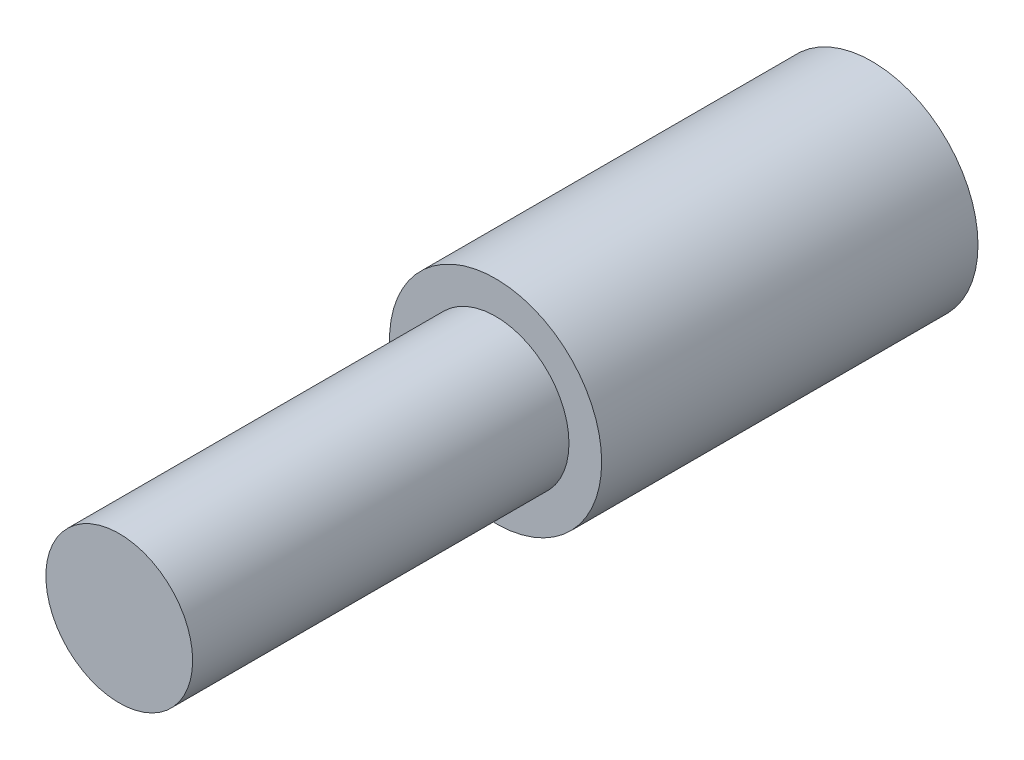
ISO-10303-21;
HEADER;
FILE_DESCRIPTION(('STEP AP214'),'2;1');
FILE_NAME('part.step','',(''),(''),'','','');
FILE_SCHEMA(('AUTOMOTIVE_DESIGN { 1 0 10303 214 1 1 1 1 }'));
ENDSEC;
DATA;
#1=APPLICATION_CONTEXT('core data for automotive mechanical design processes');
#2=APPLICATION_PROTOCOL_DEFINITION('international standard','automotive_design',2000,#1);
#3=PRODUCT_CONTEXT('',#1,'mechanical');
#4=PRODUCT('Part','Part','',(#3));
#5=PRODUCT_RELATED_PRODUCT_CATEGORY('part','',(#4));
#6=PRODUCT_DEFINITION_FORMATION('','',#4);
#7=PRODUCT_DEFINITION_CONTEXT('part definition',#1,'design');
#8=PRODUCT_DEFINITION('design','',#6,#7);
#9=PRODUCT_DEFINITION_SHAPE('','',#8);
#10=(LENGTH_UNIT() NAMED_UNIT(*) SI_UNIT(.MILLI.,.METRE.));
#11=(NAMED_UNIT(*) PLANE_ANGLE_UNIT() SI_UNIT($,.RADIAN.));
#12=(NAMED_UNIT(*) SI_UNIT($,.STERADIAN.) SOLID_ANGLE_UNIT());
#13=UNCERTAINTY_MEASURE_WITH_UNIT(LENGTH_MEASURE(1.E-05),#10,'distance_accuracy_value','');
#14=(GEOMETRIC_REPRESENTATION_CONTEXT(3) GLOBAL_UNCERTAINTY_ASSIGNED_CONTEXT((#13)) GLOBAL_UNIT_ASSIGNED_CONTEXT((#10,
#11,#12)) REPRESENTATION_CONTEXT('',''));
#15=CARTESIAN_POINT('',(0.,0.,0.));
#16=DIRECTION('',(0.,0.,1.));
#17=DIRECTION('',(1.,0.,0.));
#18=AXIS2_PLACEMENT_3D('',#15,#16,#17);
#19=CARTESIAN_POINT('',(0.,0.,20.));
#20=DIRECTION('',(0.,0.,-1.));
#21=DIRECTION('',(-1.,0.,0.));
#22=AXIS2_PLACEMENT_3D('',#19,#20,#21);
#23=CYLINDRICAL_SURFACE('',#22,3.9);
#24=CARTESIAN_POINT('',(0.,0.,20.));
#25=DIRECTION('',(0.,0.,1.));
#26=DIRECTION('',(1.,0.,0.));
#27=AXIS2_PLACEMENT_3D('',#24,#25,#26);
#28=CIRCLE('',#27,3.9);
#29=CARTESIAN_POINT('',(3.9,0.,20.));
#30=VERTEX_POINT('',#29);
#31=EDGE_CURVE('E37',#30,#30,#28,.T.);
#32=ORIENTED_EDGE('',*,*,#31,.F.);
#33=EDGE_LOOP('',(#32));
#34=FACE_BOUND('',#33,.T.);
#35=CARTESIAN_POINT('',(0.,0.,0.));
#36=DIRECTION('',(0.,0.,1.));
#37=DIRECTION('',(1.,0.,0.));
#38=AXIS2_PLACEMENT_3D('',#35,#36,#37);
#39=CIRCLE('',#38,3.9);
#40=CARTESIAN_POINT('',(3.9,0.,0.));
#41=VERTEX_POINT('',#40);
#42=EDGE_CURVE('E41',#41,#41,#39,.T.);
#43=ORIENTED_EDGE('',*,*,#42,.T.);
#44=EDGE_LOOP('',(#43));
#45=FACE_BOUND('',#44,.T.);
#46=ADVANCED_FACE('F31',(#34,#45),#23,.T.);
#47=CARTESIAN_POINT('',(0.,0.,20.));
#48=DIRECTION('',(0.,0.,1.));
#49=DIRECTION('',(1.,0.,0.));
#50=AXIS2_PLACEMENT_3D('',#47,#48,#49);
#51=PLANE('',#50);
#52=ORIENTED_EDGE('',*,*,#31,.T.);
#53=EDGE_LOOP('',(#52));
#54=FACE_BOUND('',#53,.T.);
#55=ADVANCED_FACE('F74',(#54),#51,.T.);
#56=CARTESIAN_POINT('',(0.,0.,-20.));
#57=DIRECTION('',(0.,0.,1.));
#58=DIRECTION('',(1.,0.,0.));
#59=AXIS2_PLACEMENT_3D('',#56,#57,#58);
#60=CYLINDRICAL_SURFACE('',#59,5.63678576075762);
#61=CARTESIAN_POINT('',(0.,0.,-20.));
#62=DIRECTION('',(0.,0.,1.));
#63=DIRECTION('',(1.,0.,0.));
#64=AXIS2_PLACEMENT_3D('',#61,#62,#63);
#65=CIRCLE('',#64,5.63678576075762);
#66=CARTESIAN_POINT('',(5.63678576075762,0.,-20.));
#67=VERTEX_POINT('',#66);
#68=EDGE_CURVE('E45',#67,#67,#65,.T.);
#69=ORIENTED_EDGE('',*,*,#68,.T.);
#70=EDGE_LOOP('',(#69));
#71=FACE_BOUND('',#70,.T.);
#72=CARTESIAN_POINT('',(0.,0.,0.));
#73=DIRECTION('',(0.,0.,1.));
#74=DIRECTION('',(1.,0.,0.));
#75=AXIS2_PLACEMENT_3D('',#72,#73,#74);
#76=CIRCLE('',#75,5.63678576075762);
#77=CARTESIAN_POINT('',(5.63678576075762,0.,0.));
#78=VERTEX_POINT('',#77);
#79=EDGE_CURVE('E48',#78,#78,#76,.T.);
#80=ORIENTED_EDGE('',*,*,#79,.F.);
#81=EDGE_LOOP('',(#80));
#82=FACE_BOUND('',#81,.T.);
#83=ADVANCED_FACE('F79',(#71,#82),#60,.T.);
#84=CARTESIAN_POINT('',(0.,0.,-20.));
#85=DIRECTION('',(0.,0.,1.));
#86=DIRECTION('',(1.,0.,0.));
#87=AXIS2_PLACEMENT_3D('',#84,#85,#86);
#88=PLANE('',#87);
#89=CARTESIAN_POINT('',(0.,0.,-20.));
#90=DIRECTION('',(0.,0.,1.));
#91=DIRECTION('',(1.,0.,0.));
#92=AXIS2_PLACEMENT_3D('',#89,#90,#91);
#93=CIRCLE('',#92,2.65119696762997);
#94=CARTESIAN_POINT('',(2.65119696762997,0.,-20.));
#95=VERTEX_POINT('',#94);
#96=EDGE_CURVE('E51',#95,#95,#93,.T.);
#97=ORIENTED_EDGE('',*,*,#96,.T.);
#98=EDGE_LOOP('',(#97));
#99=FACE_BOUND('',#98,.T.);
#100=ORIENTED_EDGE('',*,*,#68,.F.);
#101=EDGE_LOOP('',(#100));
#102=FACE_BOUND('',#101,.T.);
#103=ADVANCED_FACE('F57',(#99,#102),#88,.F.);
#104=CARTESIAN_POINT('',(0.,0.,0.));
#105=DIRECTION('',(0.,0.,1.));
#106=DIRECTION('',(1.,0.,0.));
#107=AXIS2_PLACEMENT_3D('',#104,#105,#106);
#108=PLANE('',#107);
#109=ORIENTED_EDGE('',*,*,#42,.F.);
#110=EDGE_LOOP('',(#109));
#111=FACE_BOUND('',#110,.T.);
#112=ORIENTED_EDGE('',*,*,#79,.T.);
#113=EDGE_LOOP('',(#112));
#114=FACE_BOUND('',#113,.T.);
#115=ADVANCED_FACE('F63',(#111,#114),#108,.T.);
#116=CARTESIAN_POINT('',(0.,0.,-20.));
#117=DIRECTION('',(0.,0.,1.));
#118=DIRECTION('',(1.,0.,0.));
#119=AXIS2_PLACEMENT_3D('',#116,#117,#118);
#120=CYLINDRICAL_SURFACE('',#119,2.65119696762997);
#121=ORIENTED_EDGE('',*,*,#96,.F.);
#122=EDGE_LOOP('',(#121));
#123=FACE_BOUND('',#122,.T.);
#124=CARTESIAN_POINT('',(0.,0.,0.));
#125=DIRECTION('',(0.,0.,1.));
#126=DIRECTION('',(1.,0.,0.));
#127=AXIS2_PLACEMENT_3D('',#124,#125,#126);
#128=CIRCLE('',#127,2.65119696762997);
#129=CARTESIAN_POINT('',(2.65119696762997,0.,0.));
#130=VERTEX_POINT('',#129);
#131=EDGE_CURVE('E10',#130,#130,#128,.T.);
#132=ORIENTED_EDGE('',*,*,#131,.T.);
#133=EDGE_LOOP('',(#132));
#134=FACE_BOUND('',#133,.T.);
#135=ADVANCED_FACE('F60',(#123,#134),#120,.F.);
#136=CARTESIAN_POINT('',(0.,0.,0.));
#137=DIRECTION('',(0.,0.,1.));
#138=DIRECTION('',(1.,0.,0.));
#139=AXIS2_PLACEMENT_3D('',#136,#137,#138);
#140=PLANE('',#139);
#141=ORIENTED_EDGE('',*,*,#131,.F.);
#142=EDGE_LOOP('',(#141));
#143=FACE_BOUND('',#142,.T.);
#144=ADVANCED_FACE('F62',(#143),#140,.F.);
#145=CLOSED_SHELL('',(#46,#55,#83,#103,#115,#135,#144));
#146=MANIFOLD_SOLID_BREP('B2',#145);
#147=ADVANCED_BREP_SHAPE_REPRESENTATION('',(#18,#146),#14);
#148=SHAPE_DEFINITION_REPRESENTATION(#9,#147);
ENDSEC;
END-ISO-10303-21;
